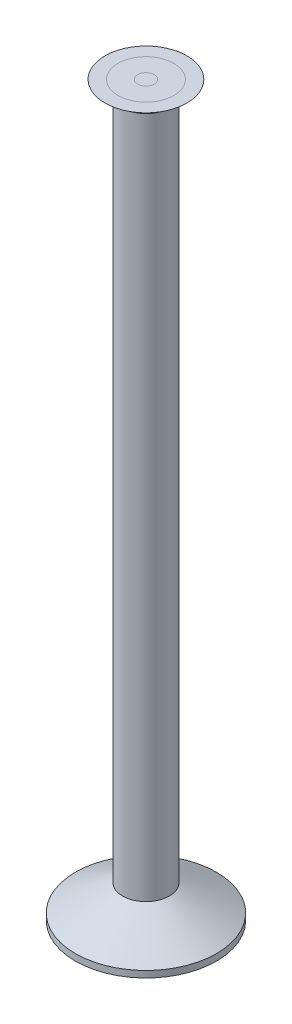
ISO-10303-21;
HEADER;
FILE_DESCRIPTION(('STEP AP214'),'2;1');
FILE_NAME('part.step','',(''),(''),'','','');
FILE_SCHEMA(('AUTOMOTIVE_DESIGN { 1 0 10303 214 1 1 1 1 }'));
ENDSEC;
DATA;
#1=APPLICATION_CONTEXT('core data for automotive mechanical design processes');
#2=APPLICATION_PROTOCOL_DEFINITION('international standard','automotive_design',2000,#1);
#3=PRODUCT_CONTEXT('',#1,'mechanical');
#4=PRODUCT('Part','Part','',(#3));
#5=PRODUCT_RELATED_PRODUCT_CATEGORY('part','',(#4));
#6=PRODUCT_DEFINITION_FORMATION('','',#4);
#7=PRODUCT_DEFINITION_CONTEXT('part definition',#1,'design');
#8=PRODUCT_DEFINITION('design','',#6,#7);
#9=PRODUCT_DEFINITION_SHAPE('','',#8);
#10=(LENGTH_UNIT() NAMED_UNIT(*) SI_UNIT(.MILLI.,.METRE.));
#11=(NAMED_UNIT(*) PLANE_ANGLE_UNIT() SI_UNIT($,.RADIAN.));
#12=(NAMED_UNIT(*) SI_UNIT($,.STERADIAN.) SOLID_ANGLE_UNIT());
#13=UNCERTAINTY_MEASURE_WITH_UNIT(LENGTH_MEASURE(1.E-05),#10,'distance_accuracy_value','');
#14=(GEOMETRIC_REPRESENTATION_CONTEXT(3) GLOBAL_UNCERTAINTY_ASSIGNED_CONTEXT((#13)) GLOBAL_UNIT_ASSIGNED_CONTEXT((#10,
#11,#12)) REPRESENTATION_CONTEXT('',''));
#15=CARTESIAN_POINT('',(0.,0.,0.));
#16=DIRECTION('',(0.,0.,1.));
#17=DIRECTION('',(1.,0.,0.));
#18=AXIS2_PLACEMENT_3D('',#15,#16,#17);
#19=CARTESIAN_POINT('',(0.,55.5,0.));
#20=DIRECTION('',(0.,1.,0.));
#21=DIRECTION('',(0.,0.,1.));
#22=AXIS2_PLACEMENT_3D('',#19,#20,#21);
#23=CYLINDRICAL_SURFACE('',#22,0.630483850989924);
#24=CARTESIAN_POINT('',(0.,55.1306712191471,0.));
#25=DIRECTION('',(0.,1.,0.));
#26=DIRECTION('',(0.,0.,1.));
#27=AXIS2_PLACEMENT_3D('',#24,#25,#26);
#28=CIRCLE('',#27,0.630483850989924);
#29=CARTESIAN_POINT('',(0.,55.1306712191471,0.630483850989924));
#30=VERTEX_POINT('',#29);
#31=EDGE_CURVE('E13',#30,#30,#28,.T.);
#32=ORIENTED_EDGE('',*,*,#31,.F.);
#33=EDGE_LOOP('',(#32));
#34=FACE_BOUND('',#33,.T.);
#35=CARTESIAN_POINT('',(0.,55.5,0.));
#36=DIRECTION('',(0.,1.,0.));
#37=DIRECTION('',(0.,0.,1.));
#38=AXIS2_PLACEMENT_3D('',#35,#36,#37);
#39=CIRCLE('',#38,0.630483850989924);
#40=CARTESIAN_POINT('',(0.,55.5,0.630483850989924));
#41=VERTEX_POINT('',#40);
#42=EDGE_CURVE('E82',#41,#41,#39,.T.);
#43=ORIENTED_EDGE('',*,*,#42,.T.);
#44=EDGE_LOOP('',(#43));
#45=FACE_BOUND('',#44,.T.);
#46=ADVANCED_FACE('F57',(#34,#45),#23,.F.);
#47=CARTESIAN_POINT('',(0.,55.1306712191471,0.));
#48=DIRECTION('',(0.,1.,0.));
#49=DIRECTION('',(0.,0.,1.));
#50=AXIS2_PLACEMENT_3D('',#47,#48,#49);
#51=CONICAL_SURFACE('',#50,0.630483850989924,0.929557348379616);
#52=CARTESIAN_POINT('',(0.,54.9399598307416,0.));
#53=DIRECTION('',(0.,1.,0.));
#54=DIRECTION('',(0.,0.,1.));
#55=AXIS2_PLACEMENT_3D('',#52,#53,#54);
#56=CIRCLE('',#55,0.37500000000001);
#57=CARTESIAN_POINT('',(0.,54.9399598307416,0.37500000000001));
#58=VERTEX_POINT('',#57);
#59=EDGE_CURVE('E63',#58,#58,#56,.T.);
#60=ORIENTED_EDGE('',*,*,#59,.F.);
#61=EDGE_LOOP('',(#60));
#62=FACE_BOUND('',#61,.T.);
#63=ORIENTED_EDGE('',*,*,#31,.T.);
#64=EDGE_LOOP('',(#63));
#65=FACE_BOUND('',#64,.T.);
#66=ADVANCED_FACE('F113',(#62,#65),#51,.F.);
#67=CARTESIAN_POINT('',(0.,55.5,0.));
#68=DIRECTION('',(0.,1.,0.));
#69=DIRECTION('',(0.,0.,1.));
#70=AXIS2_PLACEMENT_3D('',#67,#68,#69);
#71=CYLINDRICAL_SURFACE('',#70,0.375000000000005);
#72=CARTESIAN_POINT('',(0.,0.,0.));
#73=DIRECTION('',(0.,1.,0.));
#74=DIRECTION('',(0.,0.,1.));
#75=AXIS2_PLACEMENT_3D('',#72,#73,#74);
#76=CIRCLE('',#75,0.375);
#77=CARTESIAN_POINT('',(0.,0.,0.375));
#78=VERTEX_POINT('',#77);
#79=EDGE_CURVE('E67',#78,#78,#76,.T.);
#80=ORIENTED_EDGE('',*,*,#79,.F.);
#81=EDGE_LOOP('',(#80));
#82=FACE_BOUND('',#81,.T.);
#83=ORIENTED_EDGE('',*,*,#59,.T.);
#84=EDGE_LOOP('',(#83));
#85=FACE_BOUND('',#84,.T.);
#86=ADVANCED_FACE('F108',(#82,#85),#71,.F.);
#87=CARTESIAN_POINT('',(0.375,0.,0.));
#88=DIRECTION('',(0.,1.,0.));
#89=DIRECTION('',(0.,0.,1.));
#90=AXIS2_PLACEMENT_3D('',#87,#88,#89);
#91=PLANE('',#90);
#92=CARTESIAN_POINT('',(0.,0.,0.));
#93=DIRECTION('',(0.,1.,0.));
#94=DIRECTION('',(0.,0.,1.));
#95=AXIS2_PLACEMENT_3D('',#92,#93,#94);
#96=CIRCLE('',#95,1.37500000000001);
#97=CARTESIAN_POINT('',(0.,0.,1.37500000000001));
#98=VERTEX_POINT('',#97);
#99=EDGE_CURVE('E71',#98,#98,#96,.T.);
#100=ORIENTED_EDGE('',*,*,#99,.F.);
#101=EDGE_LOOP('',(#100));
#102=FACE_BOUND('',#101,.T.);
#103=ORIENTED_EDGE('',*,*,#79,.T.);
#104=EDGE_LOOP('',(#103));
#105=FACE_BOUND('',#104,.T.);
#106=ADVANCED_FACE('F102',(#102,#105),#91,.F.);
#107=CARTESIAN_POINT('',(0.,55.5,0.));
#108=DIRECTION('',(0.,1.,0.));
#109=DIRECTION('',(0.,0.,1.));
#110=AXIS2_PLACEMENT_3D('',#107,#108,#109);
#111=CYLINDRICAL_SURFACE('',#110,1.37500000000001);
#112=CARTESIAN_POINT('',(0.,54.9399598307416,0.));
#113=DIRECTION('',(0.,1.,0.));
#114=DIRECTION('',(0.,0.,1.));
#115=AXIS2_PLACEMENT_3D('',#112,#113,#114);
#116=CIRCLE('',#115,1.37500000000001);
#117=CARTESIAN_POINT('',(0.,54.9399598307416,1.37500000000001));
#118=VERTEX_POINT('',#117);
#119=EDGE_CURVE('E76',#118,#118,#116,.T.);
#120=ORIENTED_EDGE('',*,*,#119,.F.);
#121=EDGE_LOOP('',(#120));
#122=FACE_BOUND('',#121,.T.);
#123=ORIENTED_EDGE('',*,*,#99,.T.);
#124=EDGE_LOOP('',(#123));
#125=FACE_BOUND('',#124,.T.);
#126=ADVANCED_FACE('F96',(#122,#125),#111,.T.);
#127=CARTESIAN_POINT('',(0.,54.9399598307416,0.));
#128=DIRECTION('',(0.,1.,0.));
#129=DIRECTION('',(0.,0.,1.));
#130=AXIS2_PLACEMENT_3D('',#127,#128,#129);
#131=CONICAL_SURFACE('',#130,1.37500000000001,0.929557348379618);
#132=CARTESIAN_POINT('',(0.,55.5,0.));
#133=DIRECTION('',(0.,1.,0.));
#134=DIRECTION('',(0.,0.,1.));
#135=AXIS2_PLACEMENT_3D('',#132,#133,#134);
#136=CIRCLE('',#135,2.12525);
#137=CARTESIAN_POINT('',(0.,55.5,2.12525));
#138=VERTEX_POINT('',#137);
#139=EDGE_CURVE('E79',#138,#138,#136,.T.);
#140=ORIENTED_EDGE('',*,*,#139,.F.);
#141=EDGE_LOOP('',(#140));
#142=FACE_BOUND('',#141,.T.);
#143=ORIENTED_EDGE('',*,*,#119,.T.);
#144=EDGE_LOOP('',(#143));
#145=FACE_BOUND('',#144,.T.);
#146=ADVANCED_FACE('F90',(#142,#145),#131,.T.);
#147=CARTESIAN_POINT('',(2.12525,55.5,0.));
#148=DIRECTION('',(0.,-1.,0.));
#149=DIRECTION('',(0.,0.,-1.));
#150=AXIS2_PLACEMENT_3D('',#147,#148,#149);
#151=PLANE('',#150);
#152=ORIENTED_EDGE('',*,*,#42,.F.);
#153=EDGE_LOOP('',(#152));
#154=FACE_BOUND('',#153,.T.);
#155=ORIENTED_EDGE('',*,*,#139,.T.);
#156=EDGE_LOOP('',(#155));
#157=FACE_BOUND('',#156,.T.);
#158=ADVANCED_FACE('F87',(#154,#157),#151,.F.);
#159=CLOSED_SHELL('',(#46,#66,#86,#106,#126,#146,#158));
#160=MANIFOLD_SOLID_BREP('B2',#159);
#161=CARTESIAN_POINT('',(1.37500000000001,0.,0.));
#162=DIRECTION('',(0.,1.,0.));
#163=DIRECTION('',(0.,0.,1.));
#164=AXIS2_PLACEMENT_3D('',#161,#162,#163);
#165=PLANE('',#164);
#166=CARTESIAN_POINT('',(0.,0.,0.));
#167=DIRECTION('',(0.,1.,0.));
#168=DIRECTION('',(0.,0.,1.));
#169=AXIS2_PLACEMENT_3D('',#166,#167,#168);
#170=CIRCLE('',#169,5.375);
#171=CARTESIAN_POINT('',(0.,0.,5.375));
#172=VERTEX_POINT('',#171);
#173=EDGE_CURVE('E56',#172,#172,#170,.T.);
#174=ORIENTED_EDGE('',*,*,#173,.F.);
#175=EDGE_LOOP('',(#174));
#176=FACE_BOUND('',#175,.T.);
#177=CARTESIAN_POINT('',(0.,0.,0.));
#178=DIRECTION('',(0.,1.,0.));
#179=DIRECTION('',(0.,0.,1.));
#180=AXIS2_PLACEMENT_3D('',#177,#178,#179);
#181=CIRCLE('',#180,1.37500000000001);
#182=CARTESIAN_POINT('',(0.,0.,1.37500000000001));
#183=VERTEX_POINT('',#182);
#184=EDGE_CURVE('E206',#183,#183,#181,.T.);
#185=ORIENTED_EDGE('',*,*,#184,.T.);
#186=EDGE_LOOP('',(#185));
#187=FACE_BOUND('',#186,.T.);
#188=ADVANCED_FACE('F178',(#176,#187),#165,.F.);
#189=CARTESIAN_POINT('',(0.,55.5,0.));
#190=DIRECTION('',(0.,1.,0.));
#191=DIRECTION('',(0.,0.,1.));
#192=AXIS2_PLACEMENT_3D('',#189,#190,#191);
#193=CYLINDRICAL_SURFACE('',#192,5.375);
#194=CARTESIAN_POINT('',(0.,0.5,0.));
#195=DIRECTION('',(0.,1.,0.));
#196=DIRECTION('',(0.,0.,1.));
#197=AXIS2_PLACEMENT_3D('',#194,#195,#196);
#198=CIRCLE('',#197,5.375);
#199=CARTESIAN_POINT('',(0.,0.5,-5.375));
#200=VERTEX_POINT('',#199);
#201=EDGE_CURVE('E184',#200,#200,#198,.T.);
#202=ORIENTED_EDGE('',*,*,#201,.F.);
#203=EDGE_LOOP('',(#202));
#204=FACE_BOUND('',#203,.T.);
#205=ORIENTED_EDGE('',*,*,#173,.T.);
#206=EDGE_LOOP('',(#205));
#207=FACE_BOUND('',#206,.T.);
#208=ADVANCED_FACE('F243',(#204,#207),#193,.T.);
#209=CARTESIAN_POINT('',(0.,0.5,0.));
#210=DIRECTION('',(0.,-1.,0.));
#211=DIRECTION('',(0.,0.,-1.));
#212=AXIS2_PLACEMENT_3D('',#209,#210,#211);
#213=CONICAL_SURFACE('',#212,5.375,1.06310757338599);
#214=CARTESIAN_POINT('',(0.,2.5,0.));
#215=DIRECTION('',(0.,1.,0.));
#216=DIRECTION('',(0.,0.,1.));
#217=AXIS2_PLACEMENT_3D('',#214,#215,#216);
#218=CIRCLE('',#217,1.78);
#219=CARTESIAN_POINT('',(0.,2.5,-1.78));
#220=VERTEX_POINT('',#219);
#221=EDGE_CURVE('E188',#220,#220,#218,.T.);
#222=CARTESIAN_POINT('',(0.,2.5,-1.78));
#223=CARTESIAN_POINT('',(0.,2.47916666666667,-1.81744791666667));
#224=CARTESIAN_POINT('',(0.,2.45833333333334,-1.85489583333333));
#225=CARTESIAN_POINT('',(0.,2.41666666666667,-1.92979166666667));
#226=CARTESIAN_POINT('',(0.,2.39583333333334,-1.96723958333333));
#227=CARTESIAN_POINT('',(0.,2.35416666666667,-2.04213541666667));
#228=CARTESIAN_POINT('',(0.,2.33333333333334,-2.07958333333333));
#229=CARTESIAN_POINT('',(0.,2.29166666666667,-2.15447916666667));
#230=CARTESIAN_POINT('',(0.,2.27083333333334,-2.19192708333333));
#231=CARTESIAN_POINT('',(0.,2.22916666666667,-2.26682291666667));
#232=CARTESIAN_POINT('',(0.,2.20833333333334,-2.30427083333333));
#233=CARTESIAN_POINT('',(0.,2.16666666666667,-2.37916666666667));
#234=CARTESIAN_POINT('',(0.,2.14583333333334,-2.41661458333333));
#235=CARTESIAN_POINT('',(0.,2.10416666666667,-2.49151041666667));
#236=CARTESIAN_POINT('',(0.,2.08333333333334,-2.52895833333333));
#237=CARTESIAN_POINT('',(0.,2.04166666666667,-2.60385416666667));
#238=CARTESIAN_POINT('',(0.,2.02083333333333,-2.64130208333333));
#239=CARTESIAN_POINT('',(0.,1.97916666666667,-2.71619791666667));
#240=CARTESIAN_POINT('',(0.,1.95833333333334,-2.75364583333333));
#241=CARTESIAN_POINT('',(0.,1.91666666666667,-2.82854166666667));
#242=CARTESIAN_POINT('',(0.,1.89583333333334,-2.86598958333333));
#243=CARTESIAN_POINT('',(0.,1.85416666666667,-2.94088541666667));
#244=CARTESIAN_POINT('',(0.,1.83333333333334,-2.97833333333333));
#245=CARTESIAN_POINT('',(0.,1.79166666666667,-3.05322916666667));
#246=CARTESIAN_POINT('',(0.,1.77083333333334,-3.09067708333333));
#247=CARTESIAN_POINT('',(0.,1.72916666666667,-3.16557291666667));
#248=CARTESIAN_POINT('',(0.,1.70833333333333,-3.20302083333333));
#249=CARTESIAN_POINT('',(0.,1.66666666666667,-3.27791666666667));
#250=CARTESIAN_POINT('',(0.,1.64583333333333,-3.31536458333333));
#251=CARTESIAN_POINT('',(0.,1.60416666666667,-3.39026041666667));
#252=CARTESIAN_POINT('',(0.,1.58333333333333,-3.42770833333333));
#253=CARTESIAN_POINT('',(0.,1.54166666666667,-3.50260416666667));
#254=CARTESIAN_POINT('',(0.,1.52083333333333,-3.54005208333333));
#255=CARTESIAN_POINT('',(0.,1.47916666666667,-3.61494791666667));
#256=CARTESIAN_POINT('',(0.,1.45833333333333,-3.65239583333333));
#257=CARTESIAN_POINT('',(0.,1.41666666666667,-3.72729166666667));
#258=CARTESIAN_POINT('',(0.,1.39583333333333,-3.76473958333333));
#259=CARTESIAN_POINT('',(0.,1.35416666666667,-3.83963541666667));
#260=CARTESIAN_POINT('',(0.,1.33333333333333,-3.87708333333333));
#261=CARTESIAN_POINT('',(0.,1.29166666666667,-3.95197916666667));
#262=CARTESIAN_POINT('',(0.,1.27083333333333,-3.98942708333333));
#263=CARTESIAN_POINT('',(0.,1.22916666666667,-4.06432291666667));
#264=CARTESIAN_POINT('',(0.,1.20833333333333,-4.10177083333333));
#265=CARTESIAN_POINT('',(0.,1.16666666666667,-4.17666666666667));
#266=CARTESIAN_POINT('',(0.,1.14583333333333,-4.21411458333333));
#267=CARTESIAN_POINT('',(0.,1.10416666666667,-4.28901041666667));
#268=CARTESIAN_POINT('',(0.,1.08333333333333,-4.32645833333333));
#269=CARTESIAN_POINT('',(0.,1.04166666666667,-4.40135416666667));
#270=CARTESIAN_POINT('',(0.,1.02083333333333,-4.43880208333333));
#271=CARTESIAN_POINT('',(0.,0.979166666666668,-4.51369791666667));
#272=CARTESIAN_POINT('',(0.,0.958333333333334,-4.55114583333333));
#273=CARTESIAN_POINT('',(0.,0.916666666666667,-4.62604166666667));
#274=CARTESIAN_POINT('',(0.,0.895833333333334,-4.66348958333333));
#275=CARTESIAN_POINT('',(0.,0.854166666666667,-4.73838541666667));
#276=CARTESIAN_POINT('',(0.,0.833333333333334,-4.77583333333333));
#277=CARTESIAN_POINT('',(0.,0.791666666666667,-4.85072916666667));
#278=CARTESIAN_POINT('',(0.,0.770833333333334,-4.88817708333333));
#279=CARTESIAN_POINT('',(0.,0.729166666666667,-4.96307291666667));
#280=CARTESIAN_POINT('',(0.,0.708333333333334,-5.00052083333333));
#281=CARTESIAN_POINT('',(0.,0.666666666666667,-5.07541666666667));
#282=CARTESIAN_POINT('',(0.,0.645833333333334,-5.11286458333333));
#283=CARTESIAN_POINT('',(0.,0.604166666666667,-5.18776041666667));
#284=CARTESIAN_POINT('',(0.,0.583333333333334,-5.22520833333333));
#285=CARTESIAN_POINT('',(0.,0.541666666666667,-5.30010416666667));
#286=CARTESIAN_POINT('',(0.,0.520833333333334,-5.33755208333333));
#287=CARTESIAN_POINT('',(0.,0.5,-5.375));
#288=B_SPLINE_CURVE_WITH_KNOTS('',3,(#222,#223,#224,#225,#226,#227,#228,#229,#230,#231,#232,
#233,#234,#235,#236,#237,#238,#239,#240,#241,#242,#243,#244,#245,#246,#247,#248,#249,#250,#251,
#252,#253,#254,#255,#256,#257,#258,#259,#260,#261,#262,#263,#264,#265,#266,#267,#268,#269,#270,
#271,#272,#273,#274,#275,#276,#277,#278,#279,#280,#281,#282,#283,#284,#285,#286,#287),
.UNSPECIFIED.,.F.,.F.,(4,2,2,2,2,2,2,2,2,2,2,2,2,2,2,2,2,2,2,2,2,2,2,2,2,2,2,2,2,2,2,2,4),(0.,
0.128558812082496,0.257117624164992,0.385676436247487,0.514235248329983,0.642794060412479,
0.771352872494975,0.899911684577471,1.02847049665997,1.15702930874246,1.28558812082496,
1.41414693290746,1.54270574498995,1.67126455707245,1.79982336915494,1.92838218123744,
2.05694099331993,2.18549980540243,2.31405861748493,2.44261742956742,2.57117624164992,
2.69973505373241,2.82829386581491,2.9568526778974,3.0854114899799,3.2139703020624,
3.34252911414489,3.47108792622739,3.59964673830988,3.72820555039238,3.85676436247488,
3.98532317455737,4.11388198663987),.UNSPECIFIED.);
#289=EDGE_CURVE('BSEAM238',#220,#200,#288,.T.);
#290=ORIENTED_EDGE('',*,*,#221,.F.);
#291=ORIENTED_EDGE('',*,*,#201,.T.);
#292=ORIENTED_EDGE('',*,*,#289,.T.);
#293=ORIENTED_EDGE('',*,*,#289,.F.);
#294=EDGE_LOOP('',(#290,#292,#291,#293));
#295=FACE_BOUND('',#294,.T.);
#296=ADVANCED_FACE('F238',(#295),#213,.T.);
#297=CARTESIAN_POINT('',(0.,55.5,0.));
#298=DIRECTION('',(0.,1.,0.));
#299=DIRECTION('',(0.,0.,1.));
#300=AXIS2_PLACEMENT_3D('',#297,#298,#299);
#301=CYLINDRICAL_SURFACE('',#300,1.78);
#302=CARTESIAN_POINT('',(0.,54.5,0.));
#303=DIRECTION('',(0.,1.,0.));
#304=DIRECTION('',(0.,0.,1.));
#305=AXIS2_PLACEMENT_3D('',#302,#303,#304);
#306=CIRCLE('',#305,1.78);
#307=CARTESIAN_POINT('',(0.,54.5,1.78));
#308=VERTEX_POINT('',#307);
#309=EDGE_CURVE('E192',#308,#308,#306,.T.);
#310=ORIENTED_EDGE('',*,*,#309,.F.);
#311=EDGE_LOOP('',(#310));
#312=FACE_BOUND('',#311,.T.);
#313=ORIENTED_EDGE('',*,*,#221,.T.);
#314=EDGE_LOOP('',(#313));
#315=FACE_BOUND('',#314,.T.);
#316=ADVANCED_FACE('F232',(#312,#315),#301,.T.);
#317=CARTESIAN_POINT('',(0.,54.5,0.));
#318=DIRECTION('',(0.,1.,0.));
#319=DIRECTION('',(0.,0.,1.));
#320=AXIS2_PLACEMENT_3D('',#317,#318,#319);
#321=CONICAL_SURFACE('',#320,1.78,0.929557348379621);
#322=CARTESIAN_POINT('',(0.,55.5,0.));
#323=DIRECTION('',(0.,1.,0.));
#324=DIRECTION('',(0.,0.,1.));
#325=AXIS2_PLACEMENT_3D('',#322,#323,#324);
#326=CIRCLE('',#325,3.11963604966674);
#327=CARTESIAN_POINT('',(0.,55.5,3.11963604966674));
#328=VERTEX_POINT('',#327);
#329=EDGE_CURVE('E197',#328,#328,#326,.T.);
#330=ORIENTED_EDGE('',*,*,#329,.F.);
#331=EDGE_LOOP('',(#330));
#332=FACE_BOUND('',#331,.T.);
#333=ORIENTED_EDGE('',*,*,#309,.T.);
#334=EDGE_LOOP('',(#333));
#335=FACE_BOUND('',#334,.T.);
#336=ADVANCED_FACE('F226',(#332,#335),#321,.T.);
#337=CARTESIAN_POINT('',(3.11963604966674,55.5,0.));
#338=DIRECTION('',(0.,-1.,0.));
#339=DIRECTION('',(0.,0.,-1.));
#340=AXIS2_PLACEMENT_3D('',#337,#338,#339);
#341=PLANE('',#340);
#342=CARTESIAN_POINT('',(0.,55.5,0.));
#343=DIRECTION('',(0.,1.,0.));
#344=DIRECTION('',(0.,0.,1.));
#345=AXIS2_PLACEMENT_3D('',#342,#343,#344);
#346=CIRCLE('',#345,2.12525);
#347=CARTESIAN_POINT('',(0.,55.5,2.12525));
#348=VERTEX_POINT('',#347);
#349=EDGE_CURVE('E200',#348,#348,#346,.T.);
#350=ORIENTED_EDGE('',*,*,#349,.F.);
#351=EDGE_LOOP('',(#350));
#352=FACE_BOUND('',#351,.T.);
#353=ORIENTED_EDGE('',*,*,#329,.T.);
#354=EDGE_LOOP('',(#353));
#355=FACE_BOUND('',#354,.T.);
#356=ADVANCED_FACE('F220',(#352,#355),#341,.F.);
#357=CARTESIAN_POINT('',(0.,55.5,0.));
#358=DIRECTION('',(0.,1.,0.));
#359=DIRECTION('',(0.,0.,1.));
#360=AXIS2_PLACEMENT_3D('',#357,#358,#359);
#361=CONICAL_SURFACE('',#360,2.12525,0.929557348379618);
#362=CARTESIAN_POINT('',(0.,54.9399598307416,0.));
#363=DIRECTION('',(0.,1.,0.));
#364=DIRECTION('',(0.,0.,1.));
#365=AXIS2_PLACEMENT_3D('',#362,#363,#364);
#366=CIRCLE('',#365,1.37500000000001);
#367=CARTESIAN_POINT('',(0.,54.9399598307416,1.37500000000001));
#368=VERTEX_POINT('',#367);
#369=EDGE_CURVE('E203',#368,#368,#366,.T.);
#370=ORIENTED_EDGE('',*,*,#369,.F.);
#371=EDGE_LOOP('',(#370));
#372=FACE_BOUND('',#371,.T.);
#373=ORIENTED_EDGE('',*,*,#349,.T.);
#374=EDGE_LOOP('',(#373));
#375=FACE_BOUND('',#374,.T.);
#376=ADVANCED_FACE('F214',(#372,#375),#361,.F.);
#377=CARTESIAN_POINT('',(0.,55.5,0.));
#378=DIRECTION('',(0.,1.,0.));
#379=DIRECTION('',(0.,0.,1.));
#380=AXIS2_PLACEMENT_3D('',#377,#378,#379);
#381=CYLINDRICAL_SURFACE('',#380,1.37500000000001);
#382=ORIENTED_EDGE('',*,*,#184,.F.);
#383=EDGE_LOOP('',(#382));
#384=FACE_BOUND('',#383,.T.);
#385=ORIENTED_EDGE('',*,*,#369,.T.);
#386=EDGE_LOOP('',(#385));
#387=FACE_BOUND('',#386,.T.);
#388=ADVANCED_FACE('F211',(#384,#387),#381,.F.);
#389=CLOSED_SHELL('',(#188,#208,#296,#316,#336,#356,#376,#388));
#390=MANIFOLD_SOLID_BREP('B8',#389);
#391=CARTESIAN_POINT('',(0.630483850989924,55.5,0.));
#392=DIRECTION('',(0.,-1.,0.));
#393=DIRECTION('',(0.,0.,-1.));
#394=AXIS2_PLACEMENT_3D('',#391,#392,#393);
#395=PLANE('',#394);
#396=CARTESIAN_POINT('',(0.,55.5,0.));
#397=DIRECTION('',(0.,1.,0.));
#398=DIRECTION('',(0.,0.,1.));
#399=AXIS2_PLACEMENT_3D('',#396,#397,#398);
#400=CIRCLE('',#399,0.630483850989924);
#401=CARTESIAN_POINT('',(0.,55.5,0.630483850989924));
#402=VERTEX_POINT('',#401);
#403=EDGE_CURVE('E177',#402,#402,#400,.T.);
#404=ORIENTED_EDGE('',*,*,#403,.T.);
#405=EDGE_LOOP('',(#404));
#406=FACE_BOUND('',#405,.T.);
#407=ADVANCED_FACE('F305',(#406),#395,.F.);
#408=CARTESIAN_POINT('',(0.,55.5,0.));
#409=DIRECTION('',(0.,1.,0.));
#410=DIRECTION('',(0.,0.,1.));
#411=AXIS2_PLACEMENT_3D('',#408,#409,#410);
#412=CYLINDRICAL_SURFACE('',#411,0.630483850989924);
#413=ORIENTED_EDGE('',*,*,#403,.F.);
#414=EDGE_LOOP('',(#413));
#415=FACE_BOUND('',#414,.T.);
#416=CARTESIAN_POINT('',(0.,55.1306712191471,0.));
#417=DIRECTION('',(0.,1.,0.));
#418=DIRECTION('',(0.,0.,1.));
#419=AXIS2_PLACEMENT_3D('',#416,#417,#418);
#420=CIRCLE('',#419,0.630483850989924);
#421=CARTESIAN_POINT('',(0.,55.1306712191471,0.630483850989924));
#422=VERTEX_POINT('',#421);
#423=EDGE_CURVE('E311',#422,#422,#420,.T.);
#424=ORIENTED_EDGE('',*,*,#423,.T.);
#425=EDGE_LOOP('',(#424));
#426=FACE_BOUND('',#425,.T.);
#427=ADVANCED_FACE('F337',(#415,#426),#412,.T.);
#428=CARTESIAN_POINT('',(0.,54.9399598307416,0.));
#429=DIRECTION('',(0.,1.,0.));
#430=DIRECTION('',(0.,0.,1.));
#431=AXIS2_PLACEMENT_3D('',#428,#429,#430);
#432=CONICAL_SURFACE('',#431,0.37500000000001,0.929557348379616);
#433=ORIENTED_EDGE('',*,*,#423,.F.);
#434=EDGE_LOOP('',(#433));
#435=FACE_BOUND('',#434,.T.);
#436=CARTESIAN_POINT('',(0.,54.9399598307416,0.));
#437=DIRECTION('',(0.,1.,0.));
#438=DIRECTION('',(0.,0.,1.));
#439=AXIS2_PLACEMENT_3D('',#436,#437,#438);
#440=CIRCLE('',#439,0.37500000000001);
#441=CARTESIAN_POINT('',(0.,54.9399598307416,0.37500000000001));
#442=VERTEX_POINT('',#441);
#443=EDGE_CURVE('E315',#442,#442,#440,.T.);
#444=ORIENTED_EDGE('',*,*,#443,.T.);
#445=EDGE_LOOP('',(#444));
#446=FACE_BOUND('',#445,.T.);
#447=ADVANCED_FACE('F333',(#435,#446),#432,.T.);
#448=CARTESIAN_POINT('',(0.,55.5,0.));
#449=DIRECTION('',(0.,1.,0.));
#450=DIRECTION('',(0.,0.,1.));
#451=AXIS2_PLACEMENT_3D('',#448,#449,#450);
#452=CYLINDRICAL_SURFACE('',#451,0.375000000000005);
#453=ORIENTED_EDGE('',*,*,#443,.F.);
#454=EDGE_LOOP('',(#453));
#455=FACE_BOUND('',#454,.T.);
#456=CARTESIAN_POINT('',(0.,0.,0.));
#457=DIRECTION('',(0.,1.,0.));
#458=DIRECTION('',(0.,0.,1.));
#459=AXIS2_PLACEMENT_3D('',#456,#457,#458);
#460=CIRCLE('',#459,0.375);
#461=CARTESIAN_POINT('',(0.,0.,0.375));
#462=VERTEX_POINT('',#461);
#463=EDGE_CURVE('E319',#462,#462,#460,.T.);
#464=ORIENTED_EDGE('',*,*,#463,.T.);
#465=EDGE_LOOP('',(#464));
#466=FACE_BOUND('',#465,.T.);
#467=ADVANCED_FACE('F325',(#455,#466),#452,.T.);
#468=CARTESIAN_POINT('',(0.375,0.,0.));
#469=DIRECTION('',(0.,1.,0.));
#470=DIRECTION('',(0.,0.,1.));
#471=AXIS2_PLACEMENT_3D('',#468,#469,#470);
#472=PLANE('',#471);
#473=ORIENTED_EDGE('',*,*,#463,.F.);
#474=EDGE_LOOP('',(#473));
#475=FACE_BOUND('',#474,.T.);
#476=ADVANCED_FACE('F327',(#475),#472,.F.);
#477=CLOSED_SHELL('',(#407,#427,#447,#467,#476));
#478=MANIFOLD_SOLID_BREP('B51',#477);
#479=ADVANCED_BREP_SHAPE_REPRESENTATION('',(#18,#160,#390,#478),#14);
#480=SHAPE_DEFINITION_REPRESENTATION(#9,#479);
ENDSEC;
END-ISO-10303-21;
